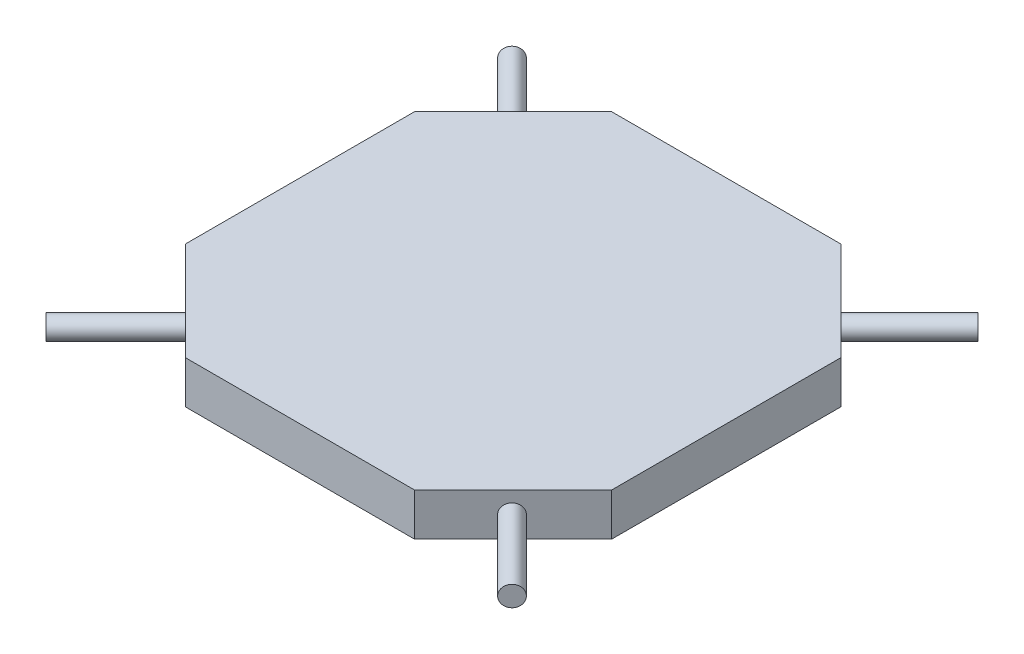
ISO-10303-21;
HEADER;
FILE_DESCRIPTION(('STEP AP214'),'2;1');
FILE_NAME('part.step','',(''),(''),'','','');
FILE_SCHEMA(('AUTOMOTIVE_DESIGN { 1 0 10303 214 1 1 1 1 }'));
ENDSEC;
DATA;
#1=APPLICATION_CONTEXT('core data for automotive mechanical design processes');
#2=APPLICATION_PROTOCOL_DEFINITION('international standard','automotive_design',2000,#1);
#3=PRODUCT_CONTEXT('',#1,'mechanical');
#4=PRODUCT('Part','Part','',(#3));
#5=PRODUCT_RELATED_PRODUCT_CATEGORY('part','',(#4));
#6=PRODUCT_DEFINITION_FORMATION('','',#4);
#7=PRODUCT_DEFINITION_CONTEXT('part definition',#1,'design');
#8=PRODUCT_DEFINITION('design','',#6,#7);
#9=PRODUCT_DEFINITION_SHAPE('','',#8);
#10=(LENGTH_UNIT() NAMED_UNIT(*) SI_UNIT(.MILLI.,.METRE.));
#11=(NAMED_UNIT(*) PLANE_ANGLE_UNIT() SI_UNIT($,.RADIAN.));
#12=(NAMED_UNIT(*) SI_UNIT($,.STERADIAN.) SOLID_ANGLE_UNIT());
#13=UNCERTAINTY_MEASURE_WITH_UNIT(LENGTH_MEASURE(1.E-05),#10,'distance_accuracy_value','');
#14=(GEOMETRIC_REPRESENTATION_CONTEXT(3) GLOBAL_UNCERTAINTY_ASSIGNED_CONTEXT((#13)) GLOBAL_UNIT_ASSIGNED_CONTEXT((#10,
#11,#12)) REPRESENTATION_CONTEXT('',''));
#15=CARTESIAN_POINT('',(0.,0.,0.));
#16=DIRECTION('',(0.,0.,1.));
#17=DIRECTION('',(1.,0.,0.));
#18=AXIS2_PLACEMENT_3D('',#15,#16,#17);
#19=CARTESIAN_POINT('',(-50.1890268504601,5.,-27.3407662849823));
#20=DIRECTION('',(0.707106781186548,0.,0.707106781186548));
#21=DIRECTION('',(0.707106781186548,0.,-0.707106781186548));
#22=AXIS2_PLACEMENT_3D('',#19,#20,#21);
#23=PLANE('',#22);
#24=CARTESIAN_POINT('',(-38.7648965677212,0.,-38.7648965677212));
#25=DIRECTION('',(0.707106781186548,0.,0.707106781186548));
#26=DIRECTION('',(0.707106781186548,0.,-0.707106781186548));
#27=AXIS2_PLACEMENT_3D('',#24,#25,#26);
#28=CIRCLE('',#27,2.39);
#29=CARTESIAN_POINT('',(-37.0749113606853,0.,-40.454881774757));
#30=VERTEX_POINT('',#29);
#31=EDGE_CURVE('E11',#30,#30,#28,.F.);
#32=ORIENTED_EDGE('',*,*,#31,.F.);
#33=EDGE_LOOP('',(#32));
#34=FACE_BOUND('',#33,.T.);
#35=DIRECTION('',(-0.707106781186548,0.,0.707106781186548));
#36=VECTOR('',#35,1.);
#37=CARTESIAN_POINT('',(-50.1890268504601,-5.,-27.3407662849823));
#38=LINE('',#37,#36);
#39=CARTESIAN_POINT('',(-27.0807772412837,-5.,-50.4490158941586));
#40=VERTEX_POINT('',#39);
#41=CARTESIAN_POINT('',(-50.1890268504601,-5.,-27.3407662849823));
#42=VERTEX_POINT('',#41);
#43=EDGE_CURVE('E141',#40,#42,#38,.T.);
#44=ORIENTED_EDGE('',*,*,#43,.T.);
#45=DIRECTION('',(0.,-1.,0.));
#46=VECTOR('',#45,1.);
#47=CARTESIAN_POINT('',(-50.1890268504601,5.,-27.3407662849823));
#48=LINE('',#47,#46);
#49=CARTESIAN_POINT('',(-50.1890268504601,5.,-27.3407662849823));
#50=VERTEX_POINT('',#49);
#51=EDGE_CURVE('E183',#50,#42,#48,.T.);
#52=ORIENTED_EDGE('',*,*,#51,.F.);
#53=DIRECTION('',(-0.707106781186548,0.,0.707106781186548));
#54=VECTOR('',#53,1.);
#55=CARTESIAN_POINT('',(-50.1890268504601,5.,-27.3407662849823));
#56=LINE('',#55,#54);
#57=CARTESIAN_POINT('',(-27.0807772412837,5.,-50.4490158941586));
#58=VERTEX_POINT('',#57);
#59=EDGE_CURVE('E164',#58,#50,#56,.T.);
#60=ORIENTED_EDGE('',*,*,#59,.F.);
#61=DIRECTION('',(0.,-1.,0.));
#62=VECTOR('',#61,1.);
#63=CARTESIAN_POINT('',(-27.0807772412837,5.,-50.4490158941586));
#64=LINE('',#63,#62);
#65=EDGE_CURVE('E137',#58,#40,#64,.T.);
#66=ORIENTED_EDGE('',*,*,#65,.T.);
#67=EDGE_LOOP('',(#44,#52,#60,#66));
#68=FACE_BOUND('',#67,.T.);
#69=ADVANCED_FACE('F39',(#34,#68),#23,.F.);
#70=CARTESIAN_POINT('',(-50.1890268504601,5.,-27.3407662849823));
#71=DIRECTION('',(1.,0.,0.));
#72=DIRECTION('',(0.,0.,-1.));
#73=AXIS2_PLACEMENT_3D('',#70,#71,#72);
#74=PLANE('',#73);
#75=DIRECTION('',(0.,0.,1.));
#76=VECTOR('',#75,1.);
#77=CARTESIAN_POINT('',(-50.1890268504601,-5.,-27.3407662849823));
#78=LINE('',#77,#76);
#79=CARTESIAN_POINT('',(-50.1890268504601,-5.,26.4427344966649));
#80=VERTEX_POINT('',#79);
#81=EDGE_CURVE('E145',#42,#80,#78,.T.);
#82=ORIENTED_EDGE('',*,*,#81,.T.);
#83=DIRECTION('',(0.,-1.,0.));
#84=VECTOR('',#83,1.);
#85=CARTESIAN_POINT('',(-50.1890268504601,5.,26.4427344966649));
#86=LINE('',#85,#84);
#87=CARTESIAN_POINT('',(-50.1890268504601,5.,26.4427344966649));
#88=VERTEX_POINT('',#87);
#89=EDGE_CURVE('E179',#88,#80,#86,.T.);
#90=ORIENTED_EDGE('',*,*,#89,.F.);
#91=DIRECTION('',(0.,0.,1.));
#92=VECTOR('',#91,1.);
#93=CARTESIAN_POINT('',(-50.1890268504601,5.,-27.3407662849823));
#94=LINE('',#93,#92);
#95=EDGE_CURVE('E100',#50,#88,#94,.T.);
#96=ORIENTED_EDGE('',*,*,#95,.F.);
#97=ORIENTED_EDGE('',*,*,#51,.T.);
#98=EDGE_LOOP('',(#82,#90,#96,#97));
#99=FACE_BOUND('',#98,.T.);
#100=ADVANCED_FACE('F253',(#99),#74,.F.);
#101=CARTESIAN_POINT('',(-50.1890268504601,5.,26.4427344966649));
#102=DIRECTION('',(0.707106781186548,0.,-0.707106781186548));
#103=DIRECTION('',(-0.707106781186548,0.,-0.707106781186548));
#104=AXIS2_PLACEMENT_3D('',#101,#102,#103);
#105=PLANE('',#104);
#106=CARTESIAN_POINT('',(-38.3158806735625,0.,38.3158806735625));
#107=DIRECTION('',(0.707106781186548,0.,-0.707106781186548));
#108=DIRECTION('',(-0.707106781186548,0.,-0.707106781186548));
#109=AXIS2_PLACEMENT_3D('',#106,#107,#108);
#110=CIRCLE('',#109,2.39);
#111=CARTESIAN_POINT('',(-40.0058658805983,0.,36.6258954665266));
#112=VERTEX_POINT('',#111);
#113=EDGE_CURVE('E186',#112,#112,#110,.T.);
#114=ORIENTED_EDGE('',*,*,#113,.T.);
#115=EDGE_LOOP('',(#114));
#116=FACE_BOUND('',#115,.T.);
#117=DIRECTION('',(0.707106781186548,0.,0.707106781186548));
#118=VECTOR('',#117,1.);
#119=CARTESIAN_POINT('',(-50.1890268504601,-5.,26.4427344966649));
#120=LINE('',#119,#118);
#121=CARTESIAN_POINT('',(-27.0807772412837,-5.,49.5509841058413));
#122=VERTEX_POINT('',#121);
#123=EDGE_CURVE('E149',#80,#122,#120,.T.);
#124=ORIENTED_EDGE('',*,*,#123,.T.);
#125=DIRECTION('',(0.,-1.,0.));
#126=VECTOR('',#125,1.);
#127=CARTESIAN_POINT('',(-27.0807772412837,5.,49.5509841058413));
#128=LINE('',#127,#126);
#129=CARTESIAN_POINT('',(-27.0807772412837,5.,49.5509841058413));
#130=VERTEX_POINT('',#129);
#131=EDGE_CURVE('E175',#130,#122,#128,.T.);
#132=ORIENTED_EDGE('',*,*,#131,.F.);
#133=DIRECTION('',(0.707106781186548,0.,0.707106781186548));
#134=VECTOR('',#133,1.);
#135=CARTESIAN_POINT('',(-50.1890268504601,5.,26.4427344966649));
#136=LINE('',#135,#134);
#137=EDGE_CURVE('E219',#88,#130,#136,.T.);
#138=ORIENTED_EDGE('',*,*,#137,.F.);
#139=ORIENTED_EDGE('',*,*,#89,.T.);
#140=EDGE_LOOP('',(#124,#132,#138,#139));
#141=FACE_BOUND('',#140,.T.);
#142=ADVANCED_FACE('F258',(#116,#141),#105,.F.);
#143=CARTESIAN_POINT('',(-27.0807772412837,5.,49.5509841058413));
#144=DIRECTION('',(0.,0.,-1.));
#145=DIRECTION('',(-1.,0.,0.));
#146=AXIS2_PLACEMENT_3D('',#143,#144,#145);
#147=PLANE('',#146);
#148=DIRECTION('',(1.,0.,0.));
#149=VECTOR('',#148,1.);
#150=CARTESIAN_POINT('',(-27.0807772412837,-5.,49.5509841058413));
#151=LINE('',#150,#149);
#152=CARTESIAN_POINT('',(26.7027235403636,-5.,49.5509841058413));
#153=VERTEX_POINT('',#152);
#154=EDGE_CURVE('E152',#122,#153,#151,.T.);
#155=ORIENTED_EDGE('',*,*,#154,.T.);
#156=DIRECTION('',(0.,-1.,0.));
#157=VECTOR('',#156,1.);
#158=CARTESIAN_POINT('',(26.7027235403636,5.,49.5509841058413));
#159=LINE('',#158,#157);
#160=CARTESIAN_POINT('',(26.7027235403636,5.,49.5509841058413));
#161=VERTEX_POINT('',#160);
#162=EDGE_CURVE('E171',#161,#153,#159,.T.);
#163=ORIENTED_EDGE('',*,*,#162,.F.);
#164=DIRECTION('',(1.,0.,0.));
#165=VECTOR('',#164,1.);
#166=CARTESIAN_POINT('',(-27.0807772412837,5.,49.5509841058413));
#167=LINE('',#166,#165);
#168=EDGE_CURVE('E222',#130,#161,#167,.T.);
#169=ORIENTED_EDGE('',*,*,#168,.F.);
#170=ORIENTED_EDGE('',*,*,#131,.T.);
#171=EDGE_LOOP('',(#155,#163,#169,#170));
#172=FACE_BOUND('',#171,.T.);
#173=ADVANCED_FACE('F230',(#172),#147,.F.);
#174=CARTESIAN_POINT('',(49.8109731495399,5.,26.4427344966649));
#175=DIRECTION('',(-0.707106781186548,0.,-0.707106781186548));
#176=DIRECTION('',(-0.707106781186548,0.,0.707106781186548));
#177=AXIS2_PLACEMENT_3D('',#174,#175,#176);
#178=PLANE('',#177);
#179=CARTESIAN_POINT('',(38.1268538231024,0.,38.1268538231024));
#180=DIRECTION('',(0.707106781186548,0.,0.707106781186547));
#181=DIRECTION('',(0.707106781186547,0.,-0.707106781186548));
#182=AXIS2_PLACEMENT_3D('',#179,#180,#181);
#183=CIRCLE('',#182,2.39);
#184=CARTESIAN_POINT('',(39.8168390301383,0.,36.4368686160666));
#185=VERTEX_POINT('',#184);
#186=EDGE_CURVE('E48',#185,#185,#183,.T.);
#187=ORIENTED_EDGE('',*,*,#186,.F.);
#188=EDGE_LOOP('',(#187));
#189=FACE_BOUND('',#188,.T.);
#190=DIRECTION('',(0.707106781186548,0.,-0.707106781186548));
#191=VECTOR('',#190,1.);
#192=CARTESIAN_POINT('',(49.8109731495399,-5.,26.4427344966649));
#193=LINE('',#192,#191);
#194=CARTESIAN_POINT('',(49.8109731495399,-5.,26.4427344966649));
#195=VERTEX_POINT('',#194);
#196=EDGE_CURVE('E155',#153,#195,#193,.T.);
#197=ORIENTED_EDGE('',*,*,#196,.T.);
#198=DIRECTION('',(0.,-1.,0.));
#199=VECTOR('',#198,1.);
#200=CARTESIAN_POINT('',(49.8109731495399,5.,26.4427344966649));
#201=LINE('',#200,#199);
#202=CARTESIAN_POINT('',(49.8109731495399,5.,26.4427344966649));
#203=VERTEX_POINT('',#202);
#204=EDGE_CURVE('E130',#203,#195,#201,.T.);
#205=ORIENTED_EDGE('',*,*,#204,.F.);
#206=DIRECTION('',(0.707106781186548,0.,-0.707106781186548));
#207=VECTOR('',#206,1.);
#208=CARTESIAN_POINT('',(49.8109731495399,5.,26.4427344966649));
#209=LINE('',#208,#207);
#210=EDGE_CURVE('E119',#161,#203,#209,.T.);
#211=ORIENTED_EDGE('',*,*,#210,.F.);
#212=ORIENTED_EDGE('',*,*,#162,.T.);
#213=EDGE_LOOP('',(#197,#205,#211,#212));
#214=FACE_BOUND('',#213,.T.);
#215=ADVANCED_FACE('F234',(#189,#214),#178,.F.);
#216=CARTESIAN_POINT('',(49.8109731495399,5.,26.4427344966649));
#217=DIRECTION('',(-1.,0.,0.));
#218=DIRECTION('',(0.,0.,1.));
#219=AXIS2_PLACEMENT_3D('',#216,#217,#218);
#220=PLANE('',#219);
#221=DIRECTION('',(0.,0.,-1.));
#222=VECTOR('',#221,1.);
#223=CARTESIAN_POINT('',(49.8109731495399,-5.,26.4427344966649));
#224=LINE('',#223,#222);
#225=CARTESIAN_POINT('',(49.8109731495399,-5.,-27.3407662849823));
#226=VERTEX_POINT('',#225);
#227=EDGE_CURVE('E128',#195,#226,#224,.T.);
#228=ORIENTED_EDGE('',*,*,#227,.T.);
#229=DIRECTION('',(0.,-1.,0.));
#230=VECTOR('',#229,1.);
#231=CARTESIAN_POINT('',(49.8109731495399,5.,-27.3407662849823));
#232=LINE('',#231,#230);
#233=CARTESIAN_POINT('',(49.8109731495399,5.,-27.3407662849823));
#234=VERTEX_POINT('',#233);
#235=EDGE_CURVE('E125',#234,#226,#232,.T.);
#236=ORIENTED_EDGE('',*,*,#235,.F.);
#237=DIRECTION('',(0.,0.,-1.));
#238=VECTOR('',#237,1.);
#239=CARTESIAN_POINT('',(49.8109731495399,5.,26.4427344966649));
#240=LINE('',#239,#238);
#241=EDGE_CURVE('E113',#203,#234,#240,.T.);
#242=ORIENTED_EDGE('',*,*,#241,.F.);
#243=ORIENTED_EDGE('',*,*,#204,.T.);
#244=EDGE_LOOP('',(#228,#236,#242,#243));
#245=FACE_BOUND('',#244,.T.);
#246=ADVANCED_FACE('F126',(#245),#220,.F.);
#247=CARTESIAN_POINT('',(49.8109731495399,5.,-27.3407662849823));
#248=DIRECTION('',(-0.707106781186548,0.,0.707106781186548));
#249=DIRECTION('',(0.707106781186548,0.,0.707106781186548));
#250=AXIS2_PLACEMENT_3D('',#247,#248,#249);
#251=PLANE('',#250);
#252=CARTESIAN_POINT('',(38.5758697172611,0.,-38.5758697172611));
#253=DIRECTION('',(-0.707106781186548,0.,0.707106781186548));
#254=DIRECTION('',(0.707106781186548,0.,0.707106781186548));
#255=AXIS2_PLACEMENT_3D('',#252,#253,#254);
#256=CIRCLE('',#255,2.39);
#257=CARTESIAN_POINT('',(40.265854924297,0.,-36.8858845102253));
#258=VERTEX_POINT('',#257);
#259=EDGE_CURVE('E190',#258,#258,#256,.T.);
#260=ORIENTED_EDGE('',*,*,#259,.T.);
#261=EDGE_LOOP('',(#260));
#262=FACE_BOUND('',#261,.T.);
#263=DIRECTION('',(-0.707106781186548,0.,-0.707106781186548));
#264=VECTOR('',#263,1.);
#265=CARTESIAN_POINT('',(49.8109731495399,-5.,-27.3407662849823));
#266=LINE('',#265,#264);
#267=CARTESIAN_POINT('',(26.7027235403636,-5.,-50.4490158941586));
#268=VERTEX_POINT('',#267);
#269=EDGE_CURVE('E85',#226,#268,#266,.T.);
#270=ORIENTED_EDGE('',*,*,#269,.T.);
#271=DIRECTION('',(0.,-1.,0.));
#272=VECTOR('',#271,1.);
#273=CARTESIAN_POINT('',(26.7027235403636,5.,-50.4490158941586));
#274=LINE('',#273,#272);
#275=CARTESIAN_POINT('',(26.7027235403636,5.,-50.4490158941586));
#276=VERTEX_POINT('',#275);
#277=EDGE_CURVE('E131',#276,#268,#274,.T.);
#278=ORIENTED_EDGE('',*,*,#277,.F.);
#279=DIRECTION('',(-0.707106781186548,0.,-0.707106781186548));
#280=VECTOR('',#279,1.);
#281=CARTESIAN_POINT('',(49.8109731495399,5.,-27.3407662849823));
#282=LINE('',#281,#280);
#283=EDGE_CURVE('E117',#234,#276,#282,.T.);
#284=ORIENTED_EDGE('',*,*,#283,.F.);
#285=ORIENTED_EDGE('',*,*,#235,.T.);
#286=EDGE_LOOP('',(#270,#278,#284,#285));
#287=FACE_BOUND('',#286,.T.);
#288=ADVANCED_FACE('F133',(#262,#287),#251,.F.);
#289=CARTESIAN_POINT('',(26.7027235403636,5.,-50.4490158941586));
#290=DIRECTION('',(0.,0.,1.));
#291=DIRECTION('',(1.,0.,0.));
#292=AXIS2_PLACEMENT_3D('',#289,#290,#291);
#293=PLANE('',#292);
#294=DIRECTION('',(-1.,0.,0.));
#295=VECTOR('',#294,1.);
#296=CARTESIAN_POINT('',(26.7027235403636,-5.,-50.4490158941586));
#297=LINE('',#296,#295);
#298=EDGE_CURVE('E91',#268,#40,#297,.T.);
#299=ORIENTED_EDGE('',*,*,#298,.T.);
#300=ORIENTED_EDGE('',*,*,#65,.F.);
#301=DIRECTION('',(-1.,0.,0.));
#302=VECTOR('',#301,1.);
#303=CARTESIAN_POINT('',(26.7027235403636,5.,-50.4490158941586));
#304=LINE('',#303,#302);
#305=EDGE_CURVE('E56',#276,#58,#304,.T.);
#306=ORIENTED_EDGE('',*,*,#305,.F.);
#307=ORIENTED_EDGE('',*,*,#277,.T.);
#308=EDGE_LOOP('',(#299,#300,#306,#307));
#309=FACE_BOUND('',#308,.T.);
#310=ADVANCED_FACE('F242',(#309),#293,.F.);
#311=CARTESIAN_POINT('',(0.,5.,0.));
#312=DIRECTION('',(0.,1.,0.));
#313=DIRECTION('',(0.,0.,1.));
#314=AXIS2_PLACEMENT_3D('',#311,#312,#313);
#315=PLANE('',#314);
#316=ORIENTED_EDGE('',*,*,#59,.T.);
#317=ORIENTED_EDGE('',*,*,#95,.T.);
#318=ORIENTED_EDGE('',*,*,#137,.T.);
#319=ORIENTED_EDGE('',*,*,#168,.T.);
#320=ORIENTED_EDGE('',*,*,#210,.T.);
#321=ORIENTED_EDGE('',*,*,#241,.T.);
#322=ORIENTED_EDGE('',*,*,#283,.T.);
#323=ORIENTED_EDGE('',*,*,#305,.T.);
#324=EDGE_LOOP('',(#316,#317,#318,#319,#320,#321,#322,#323));
#325=FACE_BOUND('',#324,.T.);
#326=ADVANCED_FACE('F115',(#325),#315,.T.);
#327=CARTESIAN_POINT('',(0.,-5.,0.));
#328=DIRECTION('',(0.,1.,0.));
#329=DIRECTION('',(0.,0.,1.));
#330=AXIS2_PLACEMENT_3D('',#327,#328,#329);
#331=PLANE('',#330);
#332=ORIENTED_EDGE('',*,*,#43,.F.);
#333=ORIENTED_EDGE('',*,*,#298,.F.);
#334=ORIENTED_EDGE('',*,*,#269,.F.);
#335=ORIENTED_EDGE('',*,*,#227,.F.);
#336=ORIENTED_EDGE('',*,*,#196,.F.);
#337=ORIENTED_EDGE('',*,*,#154,.F.);
#338=ORIENTED_EDGE('',*,*,#123,.F.);
#339=ORIENTED_EDGE('',*,*,#81,.F.);
#340=EDGE_LOOP('',(#332,#333,#334,#335,#336,#337,#338,#339));
#341=FACE_BOUND('',#340,.T.);
#342=ADVANCED_FACE('F237',(#341),#331,.F.);
#343=CARTESIAN_POINT('',(54.6731525028676,0.,54.6731525028676));
#344=DIRECTION('',(-0.707106781186548,0.,-0.707106781186547));
#345=DIRECTION('',(-0.707106781186547,0.,0.707106781186548));
#346=AXIS2_PLACEMENT_3D('',#343,#344,#345);
#347=CYLINDRICAL_SURFACE('',#346,2.39);
#348=CARTESIAN_POINT('',(54.6731525028676,0.,54.6731525028676));
#349=DIRECTION('',(0.707106781186548,0.,0.707106781186547));
#350=DIRECTION('',(0.707106781186547,0.,-0.707106781186548));
#351=AXIS2_PLACEMENT_3D('',#348,#349,#350);
#352=CIRCLE('',#351,2.39);
#353=CARTESIAN_POINT('',(56.3631377099035,0.,52.9831672958318));
#354=VERTEX_POINT('',#353);
#355=EDGE_CURVE('E146',#354,#354,#352,.T.);
#356=ORIENTED_EDGE('',*,*,#355,.F.);
#357=EDGE_LOOP('',(#356));
#358=FACE_BOUND('',#357,.T.);
#359=ORIENTED_EDGE('',*,*,#186,.T.);
#360=EDGE_LOOP('',(#359));
#361=FACE_BOUND('',#360,.T.);
#362=ADVANCED_FACE('F291',(#358,#361),#347,.T.);
#363=CARTESIAN_POINT('',(54.6731525028676,0.,54.6731525028676));
#364=DIRECTION('',(0.707106781186548,0.,0.707106781186547));
#365=DIRECTION('',(0.707106781186547,0.,-0.707106781186548));
#366=AXIS2_PLACEMENT_3D('',#363,#364,#365);
#367=PLANE('',#366);
#368=ORIENTED_EDGE('',*,*,#355,.T.);
#369=EDGE_LOOP('',(#368));
#370=FACE_BOUND('',#369,.T.);
#371=ADVANCED_FACE('F287',(#370),#367,.T.);
#372=CARTESIAN_POINT('',(-54.6731525028676,0.,54.6731525028676));
#373=DIRECTION('',(0.707106781186548,0.,-0.707106781186547));
#374=DIRECTION('',(-0.707106781186547,0.,-0.707106781186548));
#375=AXIS2_PLACEMENT_3D('',#372,#373,#374);
#376=CYLINDRICAL_SURFACE('',#375,2.39);
#377=CARTESIAN_POINT('',(-54.6731525028676,0.,54.6731525028676));
#378=DIRECTION('',(0.707106781186548,0.,-0.707106781186547));
#379=DIRECTION('',(-0.707106781186547,0.,-0.707106781186548));
#380=AXIS2_PLACEMENT_3D('',#377,#378,#379);
#381=CIRCLE('',#380,2.39);
#382=CARTESIAN_POINT('',(-56.3631377099035,0.,52.9831672958318));
#383=VERTEX_POINT('',#382);
#384=EDGE_CURVE('E189',#383,#383,#381,.T.);
#385=ORIENTED_EDGE('',*,*,#384,.T.);
#386=EDGE_LOOP('',(#385));
#387=FACE_BOUND('',#386,.T.);
#388=ORIENTED_EDGE('',*,*,#113,.F.);
#389=EDGE_LOOP('',(#388));
#390=FACE_BOUND('',#389,.T.);
#391=ADVANCED_FACE('F283',(#387,#390),#376,.T.);
#392=CARTESIAN_POINT('',(-54.6731525028676,0.,54.6731525028676));
#393=DIRECTION('',(-0.707106781186548,0.,0.707106781186547));
#394=DIRECTION('',(-0.707106781186547,0.,-0.707106781186548));
#395=AXIS2_PLACEMENT_3D('',#392,#393,#394);
#396=PLANE('',#395);
#397=ORIENTED_EDGE('',*,*,#384,.F.);
#398=EDGE_LOOP('',(#397));
#399=FACE_BOUND('',#398,.T.);
#400=ADVANCED_FACE('F280',(#399),#396,.T.);
#401=CARTESIAN_POINT('',(54.6731525028676,0.,-54.6731525028676));
#402=DIRECTION('',(-0.707106781186548,0.,0.707106781186547));
#403=DIRECTION('',(0.707106781186547,0.,0.707106781186548));
#404=AXIS2_PLACEMENT_3D('',#401,#402,#403);
#405=CYLINDRICAL_SURFACE('',#404,2.39);
#406=CARTESIAN_POINT('',(54.6731525028676,0.,-54.6731525028676));
#407=DIRECTION('',(-0.707106781186548,0.,0.707106781186547));
#408=DIRECTION('',(0.707106781186547,0.,0.707106781186548));
#409=AXIS2_PLACEMENT_3D('',#406,#407,#408);
#410=CIRCLE('',#409,2.39);
#411=CARTESIAN_POINT('',(56.3631377099035,0.,-52.9831672958318));
#412=VERTEX_POINT('',#411);
#413=EDGE_CURVE('E193',#412,#412,#410,.T.);
#414=ORIENTED_EDGE('',*,*,#413,.T.);
#415=EDGE_LOOP('',(#414));
#416=FACE_BOUND('',#415,.T.);
#417=ORIENTED_EDGE('',*,*,#259,.F.);
#418=EDGE_LOOP('',(#417));
#419=FACE_BOUND('',#418,.T.);
#420=ADVANCED_FACE('F273',(#416,#419),#405,.T.);
#421=CARTESIAN_POINT('',(54.6731525028676,0.,-54.6731525028676));
#422=DIRECTION('',(0.707106781186548,0.,-0.707106781186547));
#423=DIRECTION('',(0.707106781186547,0.,0.707106781186548));
#424=AXIS2_PLACEMENT_3D('',#421,#422,#423);
#425=PLANE('',#424);
#426=ORIENTED_EDGE('',*,*,#413,.F.);
#427=EDGE_LOOP('',(#426));
#428=FACE_BOUND('',#427,.T.);
#429=ADVANCED_FACE('F264',(#428),#425,.T.);
#430=CARTESIAN_POINT('',(-54.6731525028676,0.,-54.6731525028676));
#431=DIRECTION('',(0.707106781186548,0.,0.707106781186547));
#432=DIRECTION('',(0.707106781186547,0.,-0.707106781186548));
#433=AXIS2_PLACEMENT_3D('',#430,#431,#432);
#434=CYLINDRICAL_SURFACE('',#433,2.39);
#435=CARTESIAN_POINT('',(-54.6731525028676,0.,-54.6731525028676));
#436=DIRECTION('',(-0.707106781186548,0.,-0.707106781186547));
#437=DIRECTION('',(-0.707106781186547,0.,0.707106781186548));
#438=AXIS2_PLACEMENT_3D('',#435,#436,#437);
#439=CIRCLE('',#438,2.39);
#440=CARTESIAN_POINT('',(-56.3631377099035,0.,-52.9831672958318));
#441=VERTEX_POINT('',#440);
#442=EDGE_CURVE('E201',#441,#441,#439,.T.);
#443=ORIENTED_EDGE('',*,*,#442,.F.);
#444=EDGE_LOOP('',(#443));
#445=FACE_BOUND('',#444,.T.);
#446=ORIENTED_EDGE('',*,*,#31,.T.);
#447=EDGE_LOOP('',(#446));
#448=FACE_BOUND('',#447,.T.);
#449=ADVANCED_FACE('F261',(#445,#448),#434,.T.);
#450=CARTESIAN_POINT('',(-54.6731525028676,0.,-54.6731525028676));
#451=DIRECTION('',(-0.707106781186548,0.,-0.707106781186547));
#452=DIRECTION('',(-0.707106781186547,0.,0.707106781186548));
#453=AXIS2_PLACEMENT_3D('',#450,#451,#452);
#454=PLANE('',#453);
#455=ORIENTED_EDGE('',*,*,#442,.T.);
#456=EDGE_LOOP('',(#455));
#457=FACE_BOUND('',#456,.T.);
#458=ADVANCED_FACE('F263',(#457),#454,.T.);
#459=CLOSED_SHELL('',(#69,#100,#142,#173,#215,#246,#288,#310,#326,#342,#362,#371,#391,#400,#420,
#429,#449,#458));
#460=MANIFOLD_SOLID_BREP('B2',#459);
#461=ADVANCED_BREP_SHAPE_REPRESENTATION('',(#18,#460),#14);
#462=SHAPE_DEFINITION_REPRESENTATION(#9,#461);
ENDSEC;
END-ISO-10303-21;
